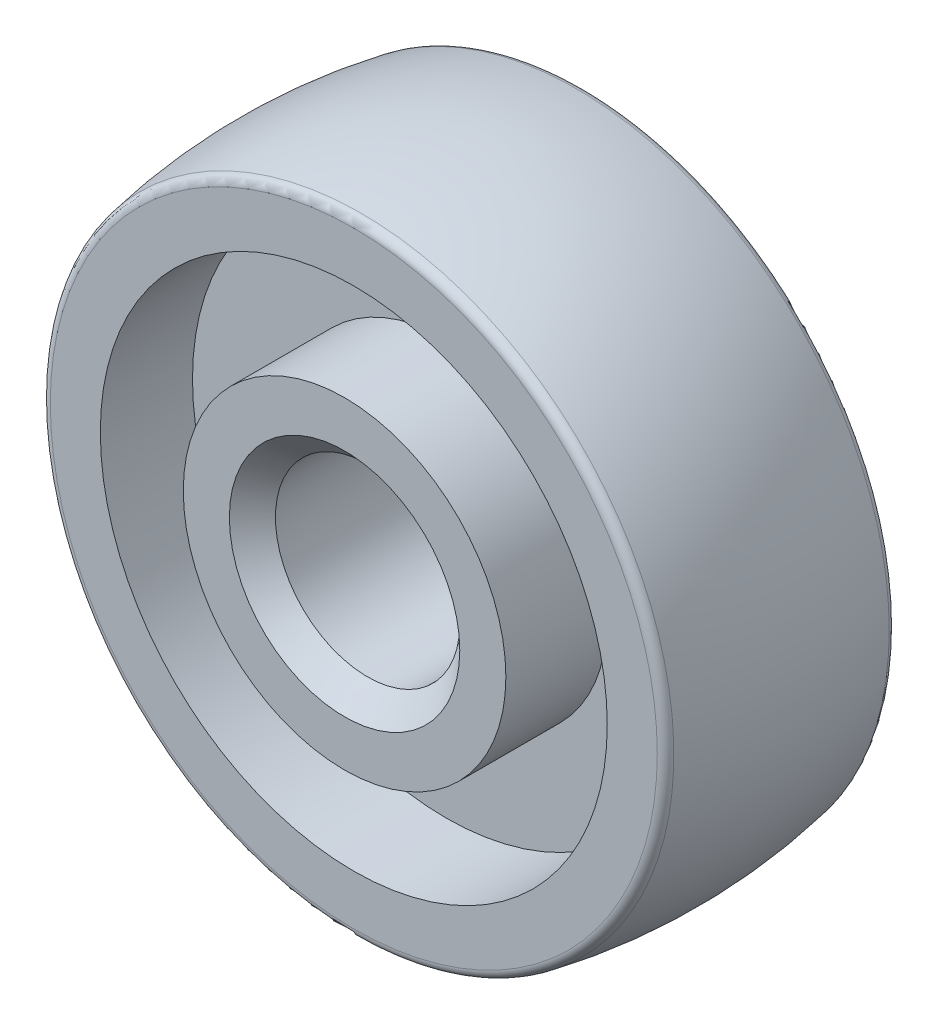
ISO-10303-21;
HEADER;
FILE_DESCRIPTION(('STEP AP214'),'2;1');
FILE_NAME('part.step','',(''),(''),'','','');
FILE_SCHEMA(('AUTOMOTIVE_DESIGN { 1 0 10303 214 1 1 1 1 }'));
ENDSEC;
DATA;
#1=APPLICATION_CONTEXT('core data for automotive mechanical design processes');
#2=APPLICATION_PROTOCOL_DEFINITION('international standard','automotive_design',2000,#1);
#3=PRODUCT_CONTEXT('',#1,'mechanical');
#4=PRODUCT('Part','Part','',(#3));
#5=PRODUCT_RELATED_PRODUCT_CATEGORY('part','',(#4));
#6=PRODUCT_DEFINITION_FORMATION('','',#4);
#7=PRODUCT_DEFINITION_CONTEXT('part definition',#1,'design');
#8=PRODUCT_DEFINITION('design','',#6,#7);
#9=PRODUCT_DEFINITION_SHAPE('','',#8);
#10=(LENGTH_UNIT() NAMED_UNIT(*) SI_UNIT(.MILLI.,.METRE.));
#11=(NAMED_UNIT(*) PLANE_ANGLE_UNIT() SI_UNIT($,.RADIAN.));
#12=(NAMED_UNIT(*) SI_UNIT($,.STERADIAN.) SOLID_ANGLE_UNIT());
#13=UNCERTAINTY_MEASURE_WITH_UNIT(LENGTH_MEASURE(1.E-05),#10,'distance_accuracy_value','');
#14=(GEOMETRIC_REPRESENTATION_CONTEXT(3) GLOBAL_UNCERTAINTY_ASSIGNED_CONTEXT((#13)) GLOBAL_UNIT_ASSIGNED_CONTEXT((#10,
#11,#12)) REPRESENTATION_CONTEXT('',''));
#15=CARTESIAN_POINT('',(0.,0.,0.));
#16=DIRECTION('',(0.,0.,1.));
#17=DIRECTION('',(1.,0.,0.));
#18=AXIS2_PLACEMENT_3D('',#15,#16,#17);
#19=CARTESIAN_POINT('',(0.,0.,-2.5));
#20=DIRECTION('',(0.,0.,1.));
#21=DIRECTION('',(1.,0.,0.));
#22=AXIS2_PLACEMENT_3D('',#19,#20,#21);
#23=PLANE('',#22);
#24=CARTESIAN_POINT('',(0.,0.,-2.5));
#25=DIRECTION('',(0.,0.,1.));
#26=DIRECTION('',(1.,0.,0.));
#27=AXIS2_PLACEMENT_3D('',#24,#25,#26);
#28=CIRCLE('',#27,6.58526719609362);
#29=CARTESIAN_POINT('',(6.58526719609362,0.,-2.5));
#30=VERTEX_POINT('',#29);
#31=EDGE_CURVE('E55',#30,#30,#28,.F.);
#32=ORIENTED_EDGE('',*,*,#31,.T.);
#33=EDGE_LOOP('',(#32));
#34=FACE_BOUND('',#33,.T.);
#35=CARTESIAN_POINT('',(0.,0.,-2.5));
#36=DIRECTION('',(0.,0.,-1.));
#37=DIRECTION('',(-1.,0.,0.));
#38=AXIS2_PLACEMENT_3D('',#35,#36,#37);
#39=CIRCLE('',#38,5.5);
#40=CARTESIAN_POINT('',(-5.5,0.,-2.5));
#41=VERTEX_POINT('',#40);
#42=EDGE_CURVE('E80',#41,#41,#39,.T.);
#43=ORIENTED_EDGE('',*,*,#42,.F.);
#44=EDGE_LOOP('',(#43));
#45=FACE_BOUND('',#44,.T.);
#46=ADVANCED_FACE('F32',(#34,#45),#23,.F.);
#47=CARTESIAN_POINT('',(0.,0.,2.5));
#48=DIRECTION('',(0.,0.,-1.));
#49=DIRECTION('',(-1.,0.,0.));
#50=AXIS2_PLACEMENT_3D('',#47,#48,#49);
#51=PLANE('',#50);
#52=CARTESIAN_POINT('',(0.,0.,2.5));
#53=DIRECTION('',(0.,0.,-1.));
#54=DIRECTION('',(-1.,0.,0.));
#55=AXIS2_PLACEMENT_3D('',#52,#53,#54);
#56=CIRCLE('',#55,6.58526719609362);
#57=CARTESIAN_POINT('',(-6.58526719609362,0.,2.5));
#58=VERTEX_POINT('',#57);
#59=EDGE_CURVE('E52',#58,#58,#56,.F.);
#60=ORIENTED_EDGE('',*,*,#59,.T.);
#61=EDGE_LOOP('',(#60));
#62=FACE_BOUND('',#61,.T.);
#63=CARTESIAN_POINT('',(0.,0.,2.5));
#64=DIRECTION('',(0.,0.,1.));
#65=DIRECTION('',(1.,0.,0.));
#66=AXIS2_PLACEMENT_3D('',#63,#64,#65);
#67=CIRCLE('',#66,5.5);
#68=CARTESIAN_POINT('',(5.5,0.,2.5));
#69=VERTEX_POINT('',#68);
#70=EDGE_CURVE('E71',#69,#69,#67,.T.);
#71=ORIENTED_EDGE('',*,*,#70,.F.);
#72=EDGE_LOOP('',(#71));
#73=FACE_BOUND('',#72,.T.);
#74=ADVANCED_FACE('F106',(#62,#73),#51,.F.);
#75=CARTESIAN_POINT('',(0.,0.,0.));
#76=DIRECTION('',(0.,0.,1.));
#77=DIRECTION('',(1.,0.,0.));
#78=AXIS2_PLACEMENT_3D('',#75,#76,#77);
#79=DEGENERATE_TOROIDAL_SURFACE('',#78,5.625,12.625,.F.);
#80=CARTESIAN_POINT('',(0.,0.,-2.33702213279678));
#81=DIRECTION('',(0.,0.,1.));
#82=DIRECTION('',(1.,0.,0.));
#83=AXIS2_PLACEMENT_3D('',#80,#81,#82);
#84=CIRCLE('',#83,6.78181073244925);
#85=CARTESIAN_POINT('',(6.78181073244925,0.,-2.33702213279678));
#86=VERTEX_POINT('',#85);
#87=EDGE_CURVE('E58',#86,#86,#84,.T.);
#88=ORIENTED_EDGE('',*,*,#87,.T.);
#89=EDGE_LOOP('',(#88));
#90=FACE_BOUND('',#89,.T.);
#91=CARTESIAN_POINT('',(0.,0.,2.33702213279678));
#92=DIRECTION('',(0.,0.,-1.));
#93=DIRECTION('',(-1.,0.,0.));
#94=AXIS2_PLACEMENT_3D('',#91,#92,#93);
#95=CIRCLE('',#94,6.78181073244925);
#96=CARTESIAN_POINT('',(-6.78181073244925,0.,2.33702213279678));
#97=VERTEX_POINT('',#96);
#98=EDGE_CURVE('E61',#97,#97,#95,.T.);
#99=ORIENTED_EDGE('',*,*,#98,.T.);
#100=EDGE_LOOP('',(#99));
#101=FACE_BOUND('',#100,.T.);
#102=ADVANCED_FACE('F112',(#90,#101),#79,.F.);
#103=CARTESIAN_POINT('',(0.,0.,2.7));
#104=DIRECTION('',(0.,0.,1.));
#105=DIRECTION('',(1.,0.,0.));
#106=AXIS2_PLACEMENT_3D('',#103,#104,#105);
#107=PLANE('',#106);
#108=CARTESIAN_POINT('',(0.,0.,2.7));
#109=DIRECTION('',(0.,0.,1.));
#110=DIRECTION('',(1.,0.,0.));
#111=AXIS2_PLACEMENT_3D('',#108,#109,#110);
#112=CIRCLE('',#111,2.5);
#113=CARTESIAN_POINT('',(2.5,0.,2.7));
#114=VERTEX_POINT('',#113);
#115=EDGE_CURVE('E10',#114,#114,#112,.F.);
#116=ORIENTED_EDGE('',*,*,#115,.T.);
#117=EDGE_LOOP('',(#116));
#118=FACE_BOUND('',#117,.T.);
#119=CARTESIAN_POINT('',(0.,0.,2.7));
#120=DIRECTION('',(0.,0.,1.));
#121=DIRECTION('',(1.,0.,0.));
#122=AXIS2_PLACEMENT_3D('',#119,#120,#121);
#123=CIRCLE('',#122,3.5);
#124=CARTESIAN_POINT('',(3.5,0.,2.7));
#125=VERTEX_POINT('',#124);
#126=EDGE_CURVE('E67',#125,#125,#123,.T.);
#127=ORIENTED_EDGE('',*,*,#126,.T.);
#128=EDGE_LOOP('',(#127));
#129=FACE_BOUND('',#128,.T.);
#130=ADVANCED_FACE('F150',(#118,#129),#107,.T.);
#131=CARTESIAN_POINT('',(0.,0.,-2.7));
#132=DIRECTION('',(0.,0.,1.));
#133=DIRECTION('',(1.,0.,0.));
#134=AXIS2_PLACEMENT_3D('',#131,#132,#133);
#135=CYLINDRICAL_SURFACE('',#134,3.5);
#136=ORIENTED_EDGE('',*,*,#126,.F.);
#137=EDGE_LOOP('',(#136));
#138=FACE_BOUND('',#137,.T.);
#139=CARTESIAN_POINT('',(0.,0.,0.5));
#140=DIRECTION('',(0.,0.,1.));
#141=DIRECTION('',(1.,0.,0.));
#142=AXIS2_PLACEMENT_3D('',#139,#140,#141);
#143=CIRCLE('',#142,3.5);
#144=CARTESIAN_POINT('',(3.5,0.,0.5));
#145=VERTEX_POINT('',#144);
#146=EDGE_CURVE('E74',#145,#145,#143,.T.);
#147=ORIENTED_EDGE('',*,*,#146,.T.);
#148=EDGE_LOOP('',(#147));
#149=FACE_BOUND('',#148,.T.);
#150=ADVANCED_FACE('F152',(#138,#149),#135,.T.);
#151=CARTESIAN_POINT('',(0.,0.,-2.7));
#152=DIRECTION('',(0.,0.,1.));
#153=DIRECTION('',(1.,0.,0.));
#154=AXIS2_PLACEMENT_3D('',#151,#152,#153);
#155=CIRCLE('',#154,3.5);
#156=CARTESIAN_POINT('',(3.5,0.,-2.7));
#157=VERTEX_POINT('',#156);
#158=EDGE_CURVE('E64',#157,#157,#155,.T.);
#159=ORIENTED_EDGE('',*,*,#158,.T.);
#160=EDGE_LOOP('',(#159));
#161=FACE_BOUND('',#160,.T.);
#162=CARTESIAN_POINT('',(0.,0.,-0.5));
#163=DIRECTION('',(0.,0.,-1.));
#164=DIRECTION('',(-1.,0.,0.));
#165=AXIS2_PLACEMENT_3D('',#162,#163,#164);
#166=CIRCLE('',#165,3.5);
#167=CARTESIAN_POINT('',(-3.5,0.,-0.5));
#168=VERTEX_POINT('',#167);
#169=EDGE_CURVE('E83',#168,#168,#166,.T.);
#170=ORIENTED_EDGE('',*,*,#169,.T.);
#171=EDGE_LOOP('',(#170));
#172=FACE_BOUND('',#171,.T.);
#173=ADVANCED_FACE('F89',(#161,#172),#135,.T.);
#174=CARTESIAN_POINT('',(0.,0.,-2.7));
#175=DIRECTION('',(0.,0.,1.));
#176=DIRECTION('',(1.,0.,0.));
#177=AXIS2_PLACEMENT_3D('',#174,#175,#176);
#178=PLANE('',#177);
#179=CARTESIAN_POINT('',(0.,0.,-2.7));
#180=DIRECTION('',(0.,0.,1.));
#181=DIRECTION('',(1.,0.,0.));
#182=AXIS2_PLACEMENT_3D('',#179,#180,#181);
#183=CIRCLE('',#182,2.5);
#184=CARTESIAN_POINT('',(2.5,0.,-2.7));
#185=VERTEX_POINT('',#184);
#186=EDGE_CURVE('E39',#185,#185,#183,.T.);
#187=ORIENTED_EDGE('',*,*,#186,.T.);
#188=EDGE_LOOP('',(#187));
#189=FACE_BOUND('',#188,.T.);
#190=ORIENTED_EDGE('',*,*,#158,.F.);
#191=EDGE_LOOP('',(#190));
#192=FACE_BOUND('',#191,.T.);
#193=ADVANCED_FACE('F137',(#189,#192),#178,.F.);
#194=CARTESIAN_POINT('',(0.,0.,-2.701));
#195=DIRECTION('',(0.,0.,1.));
#196=DIRECTION('',(1.,0.,0.));
#197=AXIS2_PLACEMENT_3D('',#194,#195,#196);
#198=CYLINDRICAL_SURFACE('',#197,2.);
#199=CARTESIAN_POINT('',(0.,0.,-2.2));
#200=DIRECTION('',(0.,0.,1.));
#201=DIRECTION('',(1.,0.,0.));
#202=AXIS2_PLACEMENT_3D('',#199,#200,#201);
#203=CIRCLE('',#202,2.);
#204=CARTESIAN_POINT('',(2.,0.,-2.2));
#205=VERTEX_POINT('',#204);
#206=EDGE_CURVE('E43',#205,#205,#203,.F.);
#207=ORIENTED_EDGE('',*,*,#206,.T.);
#208=EDGE_LOOP('',(#207));
#209=FACE_BOUND('',#208,.T.);
#210=CARTESIAN_POINT('',(0.,0.,2.2));
#211=DIRECTION('',(0.,0.,1.));
#212=DIRECTION('',(1.,0.,0.));
#213=AXIS2_PLACEMENT_3D('',#210,#211,#212);
#214=CIRCLE('',#213,2.);
#215=CARTESIAN_POINT('',(2.,0.,2.2));
#216=VERTEX_POINT('',#215);
#217=EDGE_CURVE('E47',#216,#216,#214,.T.);
#218=ORIENTED_EDGE('',*,*,#217,.T.);
#219=EDGE_LOOP('',(#218));
#220=FACE_BOUND('',#219,.T.);
#221=ADVANCED_FACE('F133',(#209,#220),#198,.F.);
#222=CARTESIAN_POINT('',(0.,0.,0.5));
#223=DIRECTION('',(0.,0.,1.));
#224=DIRECTION('',(1.,0.,0.));
#225=AXIS2_PLACEMENT_3D('',#222,#223,#224);
#226=CYLINDRICAL_SURFACE('',#225,5.5);
#227=CARTESIAN_POINT('',(0.,0.,0.5));
#228=DIRECTION('',(0.,0.,1.));
#229=DIRECTION('',(1.,0.,0.));
#230=AXIS2_PLACEMENT_3D('',#227,#228,#229);
#231=CIRCLE('',#230,5.5);
#232=CARTESIAN_POINT('',(5.5,0.,0.5));
#233=VERTEX_POINT('',#232);
#234=EDGE_CURVE('E70',#233,#233,#231,.T.);
#235=ORIENTED_EDGE('',*,*,#234,.F.);
#236=EDGE_LOOP('',(#235));
#237=FACE_BOUND('',#236,.T.);
#238=ORIENTED_EDGE('',*,*,#70,.T.);
#239=EDGE_LOOP('',(#238));
#240=FACE_BOUND('',#239,.T.);
#241=ADVANCED_FACE('F136',(#237,#240),#226,.F.);
#242=CARTESIAN_POINT('',(0.,0.,0.5));
#243=DIRECTION('',(0.,0.,1.));
#244=DIRECTION('',(1.,0.,0.));
#245=AXIS2_PLACEMENT_3D('',#242,#243,#244);
#246=PLANE('',#245);
#247=ORIENTED_EDGE('',*,*,#146,.F.);
#248=EDGE_LOOP('',(#247));
#249=FACE_BOUND('',#248,.T.);
#250=ORIENTED_EDGE('',*,*,#234,.T.);
#251=EDGE_LOOP('',(#250));
#252=FACE_BOUND('',#251,.T.);
#253=ADVANCED_FACE('F101',(#249,#252),#246,.T.);
#254=CARTESIAN_POINT('',(0.,0.,-0.5));
#255=DIRECTION('',(0.,0.,-1.));
#256=DIRECTION('',(-1.,0.,0.));
#257=AXIS2_PLACEMENT_3D('',#254,#255,#256);
#258=CYLINDRICAL_SURFACE('',#257,5.5);
#259=CARTESIAN_POINT('',(0.,0.,-0.5));
#260=DIRECTION('',(0.,0.,-1.));
#261=DIRECTION('',(-1.,0.,0.));
#262=AXIS2_PLACEMENT_3D('',#259,#260,#261);
#263=CIRCLE('',#262,5.5);
#264=CARTESIAN_POINT('',(-5.5,0.,-0.5));
#265=VERTEX_POINT('',#264);
#266=EDGE_CURVE('E79',#265,#265,#263,.T.);
#267=ORIENTED_EDGE('',*,*,#266,.F.);
#268=EDGE_LOOP('',(#267));
#269=FACE_BOUND('',#268,.T.);
#270=ORIENTED_EDGE('',*,*,#42,.T.);
#271=EDGE_LOOP('',(#270));
#272=FACE_BOUND('',#271,.T.);
#273=ADVANCED_FACE('F95',(#269,#272),#258,.F.);
#274=CARTESIAN_POINT('',(0.,0.,-0.5));
#275=DIRECTION('',(0.,0.,-1.));
#276=DIRECTION('',(-1.,0.,0.));
#277=AXIS2_PLACEMENT_3D('',#274,#275,#276);
#278=PLANE('',#277);
#279=ORIENTED_EDGE('',*,*,#169,.F.);
#280=EDGE_LOOP('',(#279));
#281=FACE_BOUND('',#280,.T.);
#282=ORIENTED_EDGE('',*,*,#266,.T.);
#283=EDGE_LOOP('',(#282));
#284=FACE_BOUND('',#283,.T.);
#285=ADVANCED_FACE('F91',(#281,#284),#278,.T.);
#286=CARTESIAN_POINT('',(0.,0.,-2.3));
#287=DIRECTION('',(0.,0.,1.));
#288=DIRECTION('',(1.,0.,0.));
#289=AXIS2_PLACEMENT_3D('',#286,#287,#288);
#290=TOROIDAL_SURFACE('',#289,6.58526719609362,0.2);
#291=ORIENTED_EDGE('',*,*,#31,.F.);
#292=EDGE_LOOP('',(#291));
#293=FACE_BOUND('',#292,.T.);
#294=ORIENTED_EDGE('',*,*,#87,.F.);
#295=EDGE_LOOP('',(#294));
#296=FACE_BOUND('',#295,.T.);
#297=ADVANCED_FACE('F94',(#293,#296),#290,.T.);
#298=CARTESIAN_POINT('',(0.,0.,2.3));
#299=DIRECTION('',(0.,0.,-1.));
#300=DIRECTION('',(-1.,0.,0.));
#301=AXIS2_PLACEMENT_3D('',#298,#299,#300);
#302=TOROIDAL_SURFACE('',#301,6.58526719609362,0.2);
#303=ORIENTED_EDGE('',*,*,#98,.F.);
#304=EDGE_LOOP('',(#303));
#305=FACE_BOUND('',#304,.T.);
#306=ORIENTED_EDGE('',*,*,#59,.F.);
#307=EDGE_LOOP('',(#306));
#308=FACE_BOUND('',#307,.T.);
#309=ADVANCED_FACE('F119',(#305,#308),#302,.T.);
#310=CARTESIAN_POINT('',(0.,0.,-2.2));
#311=DIRECTION('',(0.,0.,-1.));
#312=DIRECTION('',(-1.,0.,0.));
#313=AXIS2_PLACEMENT_3D('',#310,#311,#312);
#314=CONICAL_SURFACE('',#313,2.,0.785398163397449);
#315=ORIENTED_EDGE('',*,*,#186,.F.);
#316=EDGE_LOOP('',(#315));
#317=FACE_BOUND('',#316,.T.);
#318=ORIENTED_EDGE('',*,*,#206,.F.);
#319=EDGE_LOOP('',(#318));
#320=FACE_BOUND('',#319,.T.);
#321=ADVANCED_FACE('F122',(#317,#320),#314,.F.);
#322=CARTESIAN_POINT('',(0.,0.,2.2));
#323=DIRECTION('',(0.,0.,1.));
#324=DIRECTION('',(1.,0.,0.));
#325=AXIS2_PLACEMENT_3D('',#322,#323,#324);
#326=CONICAL_SURFACE('',#325,2.,0.78539816339745);
#327=ORIENTED_EDGE('',*,*,#115,.F.);
#328=EDGE_LOOP('',(#327));
#329=FACE_BOUND('',#328,.T.);
#330=ORIENTED_EDGE('',*,*,#217,.F.);
#331=EDGE_LOOP('',(#330));
#332=FACE_BOUND('',#331,.T.);
#333=ADVANCED_FACE('F34',(#329,#332),#326,.F.);
#334=CLOSED_SHELL('',(#46,#74,#102,#130,#150,#173,#193,#221,#241,#253,#273,#285,#297,#309,#321,#333));
#335=MANIFOLD_SOLID_BREP('B2',#334);
#336=ADVANCED_BREP_SHAPE_REPRESENTATION('',(#18,#335),#14);
#337=SHAPE_DEFINITION_REPRESENTATION(#9,#336);
ENDSEC;
END-ISO-10303-21;
